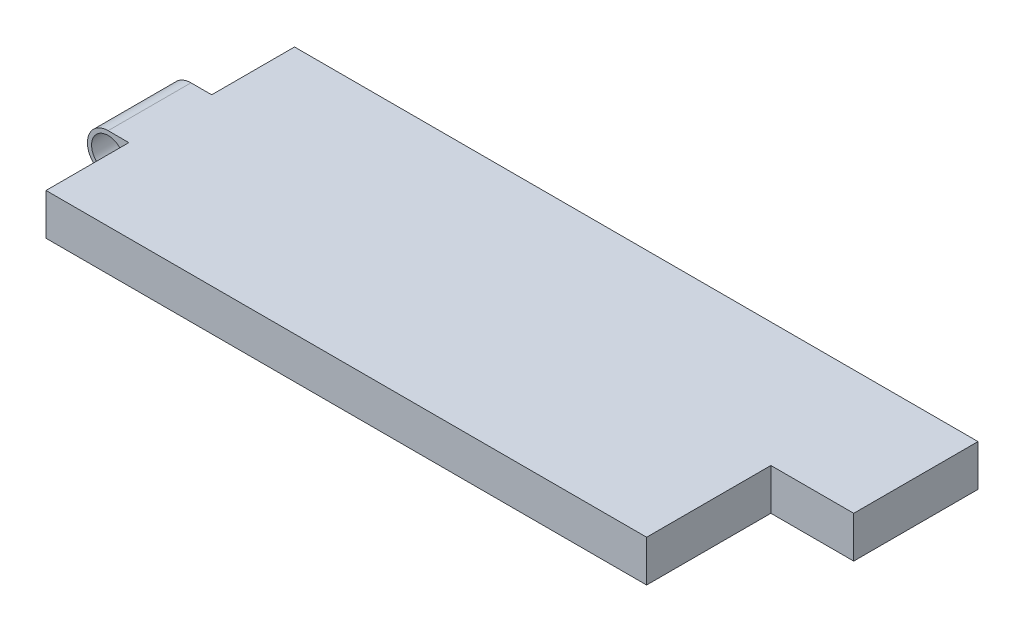
ISO-10303-21;
HEADER;
FILE_DESCRIPTION(('STEP AP214'),'2;1');
FILE_NAME('part.step','',(''),(''),'','','');
FILE_SCHEMA(('AUTOMOTIVE_DESIGN { 1 0 10303 214 1 1 1 1 }'));
ENDSEC;
DATA;
#1=APPLICATION_CONTEXT('core data for automotive mechanical design processes');
#2=APPLICATION_PROTOCOL_DEFINITION('international standard','automotive_design',2000,#1);
#3=PRODUCT_CONTEXT('',#1,'mechanical');
#4=PRODUCT('Part','Part','',(#3));
#5=PRODUCT_RELATED_PRODUCT_CATEGORY('part','',(#4));
#6=PRODUCT_DEFINITION_FORMATION('','',#4);
#7=PRODUCT_DEFINITION_CONTEXT('part definition',#1,'design');
#8=PRODUCT_DEFINITION('design','',#6,#7);
#9=PRODUCT_DEFINITION_SHAPE('','',#8);
#10=(LENGTH_UNIT() NAMED_UNIT(*) SI_UNIT(.MILLI.,.METRE.));
#11=(NAMED_UNIT(*) PLANE_ANGLE_UNIT() SI_UNIT($,.RADIAN.));
#12=(NAMED_UNIT(*) SI_UNIT($,.STERADIAN.) SOLID_ANGLE_UNIT());
#13=UNCERTAINTY_MEASURE_WITH_UNIT(LENGTH_MEASURE(1.E-05),#10,'distance_accuracy_value','');
#14=(GEOMETRIC_REPRESENTATION_CONTEXT(3) GLOBAL_UNCERTAINTY_ASSIGNED_CONTEXT((#13)) GLOBAL_UNIT_ASSIGNED_CONTEXT((#10,
#11,#12)) REPRESENTATION_CONTEXT('',''));
#15=CARTESIAN_POINT('',(0.,0.,0.));
#16=DIRECTION('',(0.,0.,1.));
#17=DIRECTION('',(1.,0.,0.));
#18=AXIS2_PLACEMENT_3D('',#15,#16,#17);
#19=CARTESIAN_POINT('',(-80.,0.,-5.));
#20=DIRECTION('',(0.,0.,1.));
#21=DIRECTION('',(1.,0.,0.));
#22=AXIS2_PLACEMENT_3D('',#19,#20,#21);
#23=PLANE('',#22);
#24=CARTESIAN_POINT('',(-80.,0.,-5.));
#25=DIRECTION('',(0.,0.,1.));
#26=DIRECTION('',(1.,0.,0.));
#27=AXIS2_PLACEMENT_3D('',#24,#25,#26);
#28=CIRCLE('',#27,2.);
#29=CARTESIAN_POINT('',(-78.,0.,-5.));
#30=VERTEX_POINT('',#29);
#31=EDGE_CURVE('E222',#30,#30,#28,.T.);
#32=ORIENTED_EDGE('',*,*,#31,.T.);
#33=EDGE_LOOP('',(#32));
#34=FACE_BOUND('',#33,.T.);
#35=DIRECTION('',(0.,1.,0.));
#36=VECTOR('',#35,1.);
#37=CARTESIAN_POINT('',(-77.5,-2.49999999999999,-5.));
#38=LINE('',#37,#36);
#39=CARTESIAN_POINT('',(-77.5,-2.5,-5.));
#40=VERTEX_POINT('',#39);
#41=CARTESIAN_POINT('',(-77.5,2.50000000000002,-5.));
#42=VERTEX_POINT('',#41);
#43=EDGE_CURVE('E50',#40,#42,#38,.T.);
#44=ORIENTED_EDGE('',*,*,#43,.F.);
#45=DIRECTION('',(1.,0.,0.));
#46=VECTOR('',#45,1.);
#47=CARTESIAN_POINT('',(0.,-2.5,-5.));
#48=LINE('',#47,#46);
#49=CARTESIAN_POINT('',(-80.,-2.5,-5.));
#50=VERTEX_POINT('',#49);
#51=EDGE_CURVE('E163',#50,#40,#48,.T.);
#52=ORIENTED_EDGE('',*,*,#51,.F.);
#53=CARTESIAN_POINT('',(-80.,0.,-5.));
#54=DIRECTION('',(0.,0.,1.));
#55=DIRECTION('',(1.,0.,0.));
#56=AXIS2_PLACEMENT_3D('',#53,#54,#55);
#57=CIRCLE('',#56,2.50000000000001);
#58=CARTESIAN_POINT('',(-80.,2.50000000000002,-5.));
#59=VERTEX_POINT('',#58);
#60=EDGE_CURVE('E224',#59,#50,#57,.T.);
#61=ORIENTED_EDGE('',*,*,#60,.F.);
#62=DIRECTION('',(-1.,0.,0.));
#63=VECTOR('',#62,1.);
#64=CARTESIAN_POINT('',(-80.,2.50000000000002,-5.));
#65=LINE('',#64,#63);
#66=EDGE_CURVE('E210',#42,#59,#65,.T.);
#67=ORIENTED_EDGE('',*,*,#66,.F.);
#68=EDGE_LOOP('',(#44,#52,#61,#67));
#69=FACE_BOUND('',#68,.T.);
#70=ADVANCED_FACE('F33',(#34,#69),#23,.F.);
#71=CARTESIAN_POINT('',(-80.,0.,-5.));
#72=DIRECTION('',(0.,0.,1.));
#73=DIRECTION('',(1.,0.,0.));
#74=AXIS2_PLACEMENT_3D('',#71,#72,#73);
#75=CYLINDRICAL_SURFACE('',#74,2.50000000000001);
#76=DIRECTION('',(0.,0.,1.));
#77=VECTOR('',#76,1.);
#78=CARTESIAN_POINT('',(-80.,-2.5,-5.));
#79=LINE('',#78,#77);
#80=CARTESIAN_POINT('',(-80.,-2.5,5.));
#81=VERTEX_POINT('',#80);
#82=EDGE_CURVE('E42',#50,#81,#79,.T.);
#83=ORIENTED_EDGE('',*,*,#82,.T.);
#84=CARTESIAN_POINT('',(-80.,0.,5.));
#85=DIRECTION('',(0.,0.,1.));
#86=DIRECTION('',(1.,0.,0.));
#87=AXIS2_PLACEMENT_3D('',#84,#85,#86);
#88=CIRCLE('',#87,2.50000000000001);
#89=CARTESIAN_POINT('',(-80.,2.50000000000002,5.));
#90=VERTEX_POINT('',#89);
#91=EDGE_CURVE('E218',#90,#81,#88,.T.);
#92=ORIENTED_EDGE('',*,*,#91,.F.);
#93=DIRECTION('',(0.,0.,1.));
#94=VECTOR('',#93,1.);
#95=CARTESIAN_POINT('',(-80.,2.50000000000002,-5.));
#96=LINE('',#95,#94);
#97=EDGE_CURVE('E11',#59,#90,#96,.T.);
#98=ORIENTED_EDGE('',*,*,#97,.F.);
#99=ORIENTED_EDGE('',*,*,#60,.T.);
#100=EDGE_LOOP('',(#83,#92,#98,#99));
#101=FACE_BOUND('',#100,.T.);
#102=ADVANCED_FACE('F35',(#101),#75,.T.);
#103=CARTESIAN_POINT('',(-80.,2.50000000000002,-5.));
#104=DIRECTION('',(0.,1.,0.));
#105=DIRECTION('',(0.,0.,1.));
#106=AXIS2_PLACEMENT_3D('',#103,#104,#105);
#107=PLANE('',#106);
#108=DIRECTION('',(0.,0.,1.));
#109=VECTOR('',#108,1.);
#110=CARTESIAN_POINT('',(-5.,2.50000000000002,0.));
#111=LINE('',#110,#109);
#112=CARTESIAN_POINT('',(-5.,2.50000000000002,0.));
#113=VERTEX_POINT('',#112);
#114=CARTESIAN_POINT('',(-5.,2.50000000000002,15.));
#115=VERTEX_POINT('',#114);
#116=EDGE_CURVE('E136',#113,#115,#111,.T.);
#117=ORIENTED_EDGE('',*,*,#116,.F.);
#118=DIRECTION('',(1.,0.,0.));
#119=VECTOR('',#118,1.);
#120=CARTESIAN_POINT('',(5.,2.50000000000002,0.));
#121=LINE('',#120,#119);
#122=CARTESIAN_POINT('',(5.,2.50000000000002,0.));
#123=VERTEX_POINT('',#122);
#124=EDGE_CURVE('E129',#113,#123,#121,.T.);
#125=ORIENTED_EDGE('',*,*,#124,.T.);
#126=DIRECTION('',(0.,0.,-1.));
#127=VECTOR('',#126,1.);
#128=CARTESIAN_POINT('',(5.,2.50000000000002,-15.));
#129=LINE('',#128,#127);
#130=CARTESIAN_POINT('',(5.,2.50000000000002,-15.));
#131=VERTEX_POINT('',#130);
#132=EDGE_CURVE('E124',#123,#131,#129,.T.);
#133=ORIENTED_EDGE('',*,*,#132,.T.);
#134=DIRECTION('',(1.,0.,0.));
#135=VECTOR('',#134,1.);
#136=CARTESIAN_POINT('',(-77.5,2.50000000000002,-15.));
#137=LINE('',#136,#135);
#138=CARTESIAN_POINT('',(-77.5,2.50000000000002,-15.));
#139=VERTEX_POINT('',#138);
#140=EDGE_CURVE('E149',#139,#131,#137,.T.);
#141=ORIENTED_EDGE('',*,*,#140,.F.);
#142=DIRECTION('',(0.,0.,1.));
#143=VECTOR('',#142,1.);
#144=CARTESIAN_POINT('',(-77.5,2.50000000000002,-15.));
#145=LINE('',#144,#143);
#146=EDGE_CURVE('E155',#139,#42,#145,.T.);
#147=ORIENTED_EDGE('',*,*,#146,.T.);
#148=ORIENTED_EDGE('',*,*,#66,.T.);
#149=ORIENTED_EDGE('',*,*,#97,.T.);
#150=DIRECTION('',(-1.,0.,0.));
#151=VECTOR('',#150,1.);
#152=CARTESIAN_POINT('',(-80.,2.50000000000002,5.));
#153=LINE('',#152,#151);
#154=CARTESIAN_POINT('',(-77.5,2.50000000000002,5.));
#155=VERTEX_POINT('',#154);
#156=EDGE_CURVE('E201',#155,#90,#153,.T.);
#157=ORIENTED_EDGE('',*,*,#156,.F.);
#158=DIRECTION('',(0.,0.,-1.));
#159=VECTOR('',#158,1.);
#160=CARTESIAN_POINT('',(-77.5,2.50000000000002,15.));
#161=LINE('',#160,#159);
#162=CARTESIAN_POINT('',(-77.5,2.50000000000002,15.));
#163=VERTEX_POINT('',#162);
#164=EDGE_CURVE('E192',#163,#155,#161,.T.);
#165=ORIENTED_EDGE('',*,*,#164,.F.);
#166=DIRECTION('',(-1.,0.,0.));
#167=VECTOR('',#166,1.);
#168=CARTESIAN_POINT('',(0.,2.50000000000002,15.));
#169=LINE('',#168,#167);
#170=EDGE_CURVE('E158',#115,#163,#169,.T.);
#171=ORIENTED_EDGE('',*,*,#170,.F.);
#172=EDGE_LOOP('',(#117,#125,#133,#141,#147,#148,#149,#157,#165,#171));
#173=FACE_BOUND('',#172,.T.);
#174=ADVANCED_FACE('F178',(#173),#107,.T.);
#175=CARTESIAN_POINT('',(0.,-2.5,-5.));
#176=DIRECTION('',(0.,-1.,0.));
#177=DIRECTION('',(0.,0.,-1.));
#178=AXIS2_PLACEMENT_3D('',#175,#176,#177);
#179=PLANE('',#178);
#180=DIRECTION('',(0.,0.,1.));
#181=VECTOR('',#180,1.);
#182=CARTESIAN_POINT('',(-5.,-2.49999999999998,0.));
#183=LINE('',#182,#181);
#184=CARTESIAN_POINT('',(-5.,-2.49999999999998,0.));
#185=VERTEX_POINT('',#184);
#186=CARTESIAN_POINT('',(-5.,-2.49999999999998,15.));
#187=VERTEX_POINT('',#186);
#188=EDGE_CURVE('E119',#185,#187,#183,.T.);
#189=ORIENTED_EDGE('',*,*,#188,.T.);
#190=DIRECTION('',(1.,0.,0.));
#191=VECTOR('',#190,1.);
#192=CARTESIAN_POINT('',(-77.5,-2.5,15.));
#193=LINE('',#192,#191);
#194=CARTESIAN_POINT('',(-77.5,-2.5,15.));
#195=VERTEX_POINT('',#194);
#196=EDGE_CURVE('E186',#195,#187,#193,.T.);
#197=ORIENTED_EDGE('',*,*,#196,.F.);
#198=DIRECTION('',(0.,0.,-1.));
#199=VECTOR('',#198,1.);
#200=CARTESIAN_POINT('',(-77.5,-2.5,15.));
#201=LINE('',#200,#199);
#202=CARTESIAN_POINT('',(-77.5,-2.5,5.));
#203=VERTEX_POINT('',#202);
#204=EDGE_CURVE('E190',#195,#203,#201,.T.);
#205=ORIENTED_EDGE('',*,*,#204,.T.);
#206=DIRECTION('',(1.,0.,0.));
#207=VECTOR('',#206,1.);
#208=CARTESIAN_POINT('',(0.,-2.5,5.));
#209=LINE('',#208,#207);
#210=EDGE_CURVE('E216',#81,#203,#209,.T.);
#211=ORIENTED_EDGE('',*,*,#210,.F.);
#212=ORIENTED_EDGE('',*,*,#82,.F.);
#213=ORIENTED_EDGE('',*,*,#51,.T.);
#214=DIRECTION('',(0.,0.,1.));
#215=VECTOR('',#214,1.);
#216=CARTESIAN_POINT('',(-77.5,-2.49999999999999,-15.));
#217=LINE('',#216,#215);
#218=CARTESIAN_POINT('',(-77.5,-2.49999999999999,-15.));
#219=VERTEX_POINT('',#218);
#220=EDGE_CURVE('E168',#219,#40,#217,.T.);
#221=ORIENTED_EDGE('',*,*,#220,.F.);
#222=DIRECTION('',(-1.,0.,0.));
#223=VECTOR('',#222,1.);
#224=CARTESIAN_POINT('',(0.,-2.5,-15.));
#225=LINE('',#224,#223);
#226=CARTESIAN_POINT('',(5.,-2.49999999999998,-15.));
#227=VERTEX_POINT('',#226);
#228=EDGE_CURVE('E151',#227,#219,#225,.T.);
#229=ORIENTED_EDGE('',*,*,#228,.F.);
#230=DIRECTION('',(0.,0.,-1.));
#231=VECTOR('',#230,1.);
#232=CARTESIAN_POINT('',(5.,-2.49999999999998,-15.));
#233=LINE('',#232,#231);
#234=CARTESIAN_POINT('',(5.,-2.49999999999998,0.));
#235=VERTEX_POINT('',#234);
#236=EDGE_CURVE('E122',#235,#227,#233,.T.);
#237=ORIENTED_EDGE('',*,*,#236,.F.);
#238=DIRECTION('',(1.,0.,0.));
#239=VECTOR('',#238,1.);
#240=CARTESIAN_POINT('',(5.,-2.49999999999998,0.));
#241=LINE('',#240,#239);
#242=EDGE_CURVE('E114',#185,#235,#241,.T.);
#243=ORIENTED_EDGE('',*,*,#242,.F.);
#244=EDGE_LOOP('',(#189,#197,#205,#211,#212,#213,#221,#229,#237,#243));
#245=FACE_BOUND('',#244,.T.);
#246=ADVANCED_FACE('F116',(#245),#179,.T.);
#247=CARTESIAN_POINT('',(-80.,0.,-5.));
#248=DIRECTION('',(0.,0.,1.));
#249=DIRECTION('',(1.,0.,0.));
#250=AXIS2_PLACEMENT_3D('',#247,#248,#249);
#251=CYLINDRICAL_SURFACE('',#250,2.);
#252=ORIENTED_EDGE('',*,*,#31,.F.);
#253=EDGE_LOOP('',(#252));
#254=FACE_BOUND('',#253,.T.);
#255=CARTESIAN_POINT('',(-80.,0.,5.));
#256=DIRECTION('',(0.,0.,1.));
#257=DIRECTION('',(1.,0.,0.));
#258=AXIS2_PLACEMENT_3D('',#255,#256,#257);
#259=CIRCLE('',#258,2.);
#260=CARTESIAN_POINT('',(-78.,0.,5.));
#261=VERTEX_POINT('',#260);
#262=EDGE_CURVE('E197',#261,#261,#259,.T.);
#263=ORIENTED_EDGE('',*,*,#262,.T.);
#264=EDGE_LOOP('',(#263));
#265=FACE_BOUND('',#264,.T.);
#266=ADVANCED_FACE('F257',(#254,#265),#251,.F.);
#267=CARTESIAN_POINT('',(-80.,0.,5.));
#268=DIRECTION('',(0.,0.,1.));
#269=DIRECTION('',(1.,0.,0.));
#270=AXIS2_PLACEMENT_3D('',#267,#268,#269);
#271=PLANE('',#270);
#272=DIRECTION('',(0.,-1.,0.));
#273=VECTOR('',#272,1.);
#274=CARTESIAN_POINT('',(-77.5,2.50000000000002,5.));
#275=LINE('',#274,#273);
#276=EDGE_CURVE('E58',#155,#203,#275,.T.);
#277=ORIENTED_EDGE('',*,*,#276,.F.);
#278=ORIENTED_EDGE('',*,*,#156,.T.);
#279=ORIENTED_EDGE('',*,*,#91,.T.);
#280=ORIENTED_EDGE('',*,*,#210,.T.);
#281=EDGE_LOOP('',(#277,#278,#279,#280));
#282=FACE_BOUND('',#281,.T.);
#283=ORIENTED_EDGE('',*,*,#262,.F.);
#284=EDGE_LOOP('',(#283));
#285=FACE_BOUND('',#284,.T.);
#286=ADVANCED_FACE('F264',(#282,#285),#271,.T.);
#287=CARTESIAN_POINT('',(-77.5,2.50000000000002,15.));
#288=DIRECTION('',(1.,0.,0.));
#289=DIRECTION('',(0.,0.,-1.));
#290=AXIS2_PLACEMENT_3D('',#287,#288,#289);
#291=PLANE('',#290);
#292=ORIENTED_EDGE('',*,*,#276,.T.);
#293=ORIENTED_EDGE('',*,*,#204,.F.);
#294=DIRECTION('',(0.,-1.,0.));
#295=VECTOR('',#294,1.);
#296=CARTESIAN_POINT('',(-77.5,2.50000000000002,15.));
#297=LINE('',#296,#295);
#298=EDGE_CURVE('E187',#163,#195,#297,.T.);
#299=ORIENTED_EDGE('',*,*,#298,.F.);
#300=ORIENTED_EDGE('',*,*,#164,.T.);
#301=EDGE_LOOP('',(#292,#293,#299,#300));
#302=FACE_BOUND('',#301,.T.);
#303=ADVANCED_FACE('F269',(#302),#291,.F.);
#304=CARTESIAN_POINT('',(0.,0.,15.));
#305=DIRECTION('',(0.,0.,1.));
#306=DIRECTION('',(1.,0.,0.));
#307=AXIS2_PLACEMENT_3D('',#304,#305,#306);
#308=PLANE('',#307);
#309=DIRECTION('',(0.,1.,0.));
#310=VECTOR('',#309,1.);
#311=CARTESIAN_POINT('',(-5.,-2.49999999999998,15.));
#312=LINE('',#311,#310);
#313=EDGE_CURVE('E132',#187,#115,#312,.T.);
#314=ORIENTED_EDGE('',*,*,#313,.T.);
#315=ORIENTED_EDGE('',*,*,#170,.T.);
#316=ORIENTED_EDGE('',*,*,#298,.T.);
#317=ORIENTED_EDGE('',*,*,#196,.T.);
#318=EDGE_LOOP('',(#314,#315,#316,#317));
#319=FACE_BOUND('',#318,.T.);
#320=ADVANCED_FACE('F184',(#319),#308,.T.);
#321=CARTESIAN_POINT('',(-77.5,-2.49999999999999,-15.));
#322=DIRECTION('',(1.,0.,0.));
#323=DIRECTION('',(0.,0.,-1.));
#324=AXIS2_PLACEMENT_3D('',#321,#322,#323);
#325=PLANE('',#324);
#326=ORIENTED_EDGE('',*,*,#43,.T.);
#327=ORIENTED_EDGE('',*,*,#146,.F.);
#328=DIRECTION('',(0.,1.,0.));
#329=VECTOR('',#328,1.);
#330=CARTESIAN_POINT('',(-77.5,-2.49999999999999,-15.));
#331=LINE('',#330,#329);
#332=EDGE_CURVE('E153',#219,#139,#331,.T.);
#333=ORIENTED_EDGE('',*,*,#332,.F.);
#334=ORIENTED_EDGE('',*,*,#220,.T.);
#335=EDGE_LOOP('',(#326,#327,#333,#334));
#336=FACE_BOUND('',#335,.T.);
#337=ADVANCED_FACE('F233',(#336),#325,.F.);
#338=CARTESIAN_POINT('',(0.,0.,-15.));
#339=DIRECTION('',(0.,0.,-1.));
#340=DIRECTION('',(-1.,0.,0.));
#341=AXIS2_PLACEMENT_3D('',#338,#339,#340);
#342=PLANE('',#341);
#343=ORIENTED_EDGE('',*,*,#140,.T.);
#344=DIRECTION('',(0.,1.,0.));
#345=VECTOR('',#344,1.);
#346=CARTESIAN_POINT('',(5.,-2.49999999999998,-15.));
#347=LINE('',#346,#345);
#348=EDGE_CURVE('E145',#227,#131,#347,.T.);
#349=ORIENTED_EDGE('',*,*,#348,.F.);
#350=ORIENTED_EDGE('',*,*,#228,.T.);
#351=ORIENTED_EDGE('',*,*,#332,.T.);
#352=EDGE_LOOP('',(#343,#349,#350,#351));
#353=FACE_BOUND('',#352,.T.);
#354=ADVANCED_FACE('F236',(#353),#342,.T.);
#355=CARTESIAN_POINT('',(5.,-2.49999999999998,-15.));
#356=DIRECTION('',(1.,0.,0.));
#357=DIRECTION('',(0.,0.,-1.));
#358=AXIS2_PLACEMENT_3D('',#355,#356,#357);
#359=PLANE('',#358);
#360=ORIENTED_EDGE('',*,*,#132,.F.);
#361=DIRECTION('',(0.,1.,0.));
#362=VECTOR('',#361,1.);
#363=CARTESIAN_POINT('',(5.,-2.49999999999998,0.));
#364=LINE('',#363,#362);
#365=EDGE_CURVE('E142',#235,#123,#364,.T.);
#366=ORIENTED_EDGE('',*,*,#365,.F.);
#367=ORIENTED_EDGE('',*,*,#236,.T.);
#368=ORIENTED_EDGE('',*,*,#348,.T.);
#369=EDGE_LOOP('',(#360,#366,#367,#368));
#370=FACE_BOUND('',#369,.T.);
#371=ADVANCED_FACE('F239',(#370),#359,.T.);
#372=CARTESIAN_POINT('',(5.,-2.49999999999998,0.));
#373=DIRECTION('',(0.,0.,1.));
#374=DIRECTION('',(1.,0.,0.));
#375=AXIS2_PLACEMENT_3D('',#372,#373,#374);
#376=PLANE('',#375);
#377=ORIENTED_EDGE('',*,*,#124,.F.);
#378=DIRECTION('',(0.,1.,0.));
#379=VECTOR('',#378,1.);
#380=CARTESIAN_POINT('',(-5.,-2.49999999999998,0.));
#381=LINE('',#380,#379);
#382=EDGE_CURVE('E126',#185,#113,#381,.T.);
#383=ORIENTED_EDGE('',*,*,#382,.F.);
#384=ORIENTED_EDGE('',*,*,#242,.T.);
#385=ORIENTED_EDGE('',*,*,#365,.T.);
#386=EDGE_LOOP('',(#377,#383,#384,#385));
#387=FACE_BOUND('',#386,.T.);
#388=ADVANCED_FACE('F127',(#387),#376,.T.);
#389=CARTESIAN_POINT('',(-5.,-2.49999999999998,0.));
#390=DIRECTION('',(-1.,0.,0.));
#391=DIRECTION('',(0.,0.,1.));
#392=AXIS2_PLACEMENT_3D('',#389,#390,#391);
#393=PLANE('',#392);
#394=ORIENTED_EDGE('',*,*,#116,.T.);
#395=ORIENTED_EDGE('',*,*,#313,.F.);
#396=ORIENTED_EDGE('',*,*,#188,.F.);
#397=ORIENTED_EDGE('',*,*,#382,.T.);
#398=EDGE_LOOP('',(#394,#395,#396,#397));
#399=FACE_BOUND('',#398,.T.);
#400=ADVANCED_FACE('F134',(#399),#393,.F.);
#401=CLOSED_SHELL('',(#70,#102,#174,#246,#266,#286,#303,#320,#337,#354,#371,#388,#400));
#402=MANIFOLD_SOLID_BREP('B2',#401);
#403=ADVANCED_BREP_SHAPE_REPRESENTATION('',(#18,#402),#14);
#404=SHAPE_DEFINITION_REPRESENTATION(#9,#403);
ENDSEC;
END-ISO-10303-21;
